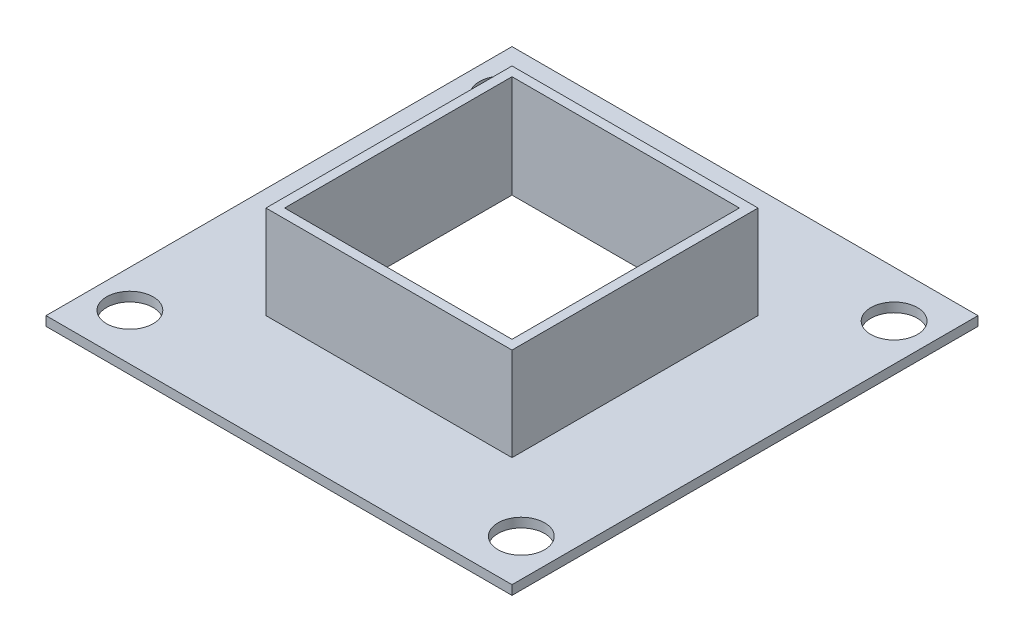
ISO-10303-21;
HEADER;
FILE_DESCRIPTION(('STEP AP214'),'2;1');
FILE_NAME('part.step','',(''),(''),'','','');
FILE_SCHEMA(('AUTOMOTIVE_DESIGN { 1 0 10303 214 1 1 1 1 }'));
ENDSEC;
DATA;
#1=APPLICATION_CONTEXT('core data for automotive mechanical design processes');
#2=APPLICATION_PROTOCOL_DEFINITION('international standard','automotive_design',2000,#1);
#3=PRODUCT_CONTEXT('',#1,'mechanical');
#4=PRODUCT('Part','Part','',(#3));
#5=PRODUCT_RELATED_PRODUCT_CATEGORY('part','',(#4));
#6=PRODUCT_DEFINITION_FORMATION('','',#4);
#7=PRODUCT_DEFINITION_CONTEXT('part definition',#1,'design');
#8=PRODUCT_DEFINITION('design','',#6,#7);
#9=PRODUCT_DEFINITION_SHAPE('','',#8);
#10=(LENGTH_UNIT() NAMED_UNIT(*) SI_UNIT(.MILLI.,.METRE.));
#11=(NAMED_UNIT(*) PLANE_ANGLE_UNIT() SI_UNIT($,.RADIAN.));
#12=(NAMED_UNIT(*) SI_UNIT($,.STERADIAN.) SOLID_ANGLE_UNIT());
#13=UNCERTAINTY_MEASURE_WITH_UNIT(LENGTH_MEASURE(1.E-05),#10,'distance_accuracy_value','');
#14=(GEOMETRIC_REPRESENTATION_CONTEXT(3) GLOBAL_UNCERTAINTY_ASSIGNED_CONTEXT((#13)) GLOBAL_UNIT_ASSIGNED_CONTEXT((#10,
#11,#12)) REPRESENTATION_CONTEXT('',''));
#15=CARTESIAN_POINT('',(0.,0.,0.));
#16=DIRECTION('',(0.,0.,1.));
#17=DIRECTION('',(1.,0.,0.));
#18=AXIS2_PLACEMENT_3D('',#15,#16,#17);
#19=CARTESIAN_POINT('',(0.,25.4,0.));
#20=DIRECTION('',(0.,-1.,0.));
#21=DIRECTION('',(0.,0.,-1.));
#22=AXIS2_PLACEMENT_3D('',#19,#20,#21);
#23=PLANE('',#22);
#24=DIRECTION('',(-1.,0.,0.));
#25=VECTOR('',#24,1.);
#26=CARTESIAN_POINT('',(-33.528,25.4,-33.528));
#27=LINE('',#26,#25);
#28=CARTESIAN_POINT('',(33.528,25.4,-33.528));
#29=VERTEX_POINT('',#28);
#30=CARTESIAN_POINT('',(-33.528,25.4,-33.528));
#31=VERTEX_POINT('',#30);
#32=EDGE_CURVE('E257',#29,#31,#27,.T.);
#33=ORIENTED_EDGE('',*,*,#32,.T.);
#34=DIRECTION('',(0.,0.,1.));
#35=VECTOR('',#34,1.);
#36=CARTESIAN_POINT('',(-33.528,25.4,-33.528));
#37=LINE('',#36,#35);
#38=CARTESIAN_POINT('',(-33.528,25.4,33.528));
#39=VERTEX_POINT('',#38);
#40=EDGE_CURVE('E261',#31,#39,#37,.T.);
#41=ORIENTED_EDGE('',*,*,#40,.T.);
#42=DIRECTION('',(1.,0.,0.));
#43=VECTOR('',#42,1.);
#44=CARTESIAN_POINT('',(-33.528,25.4,33.528));
#45=LINE('',#44,#43);
#46=CARTESIAN_POINT('',(33.528,25.4,33.528));
#47=VERTEX_POINT('',#46);
#48=EDGE_CURVE('E265',#39,#47,#45,.T.);
#49=ORIENTED_EDGE('',*,*,#48,.T.);
#50=DIRECTION('',(0.,0.,-1.));
#51=VECTOR('',#50,1.);
#52=CARTESIAN_POINT('',(33.528,25.4,-33.528));
#53=LINE('',#52,#51);
#54=EDGE_CURVE('E268',#47,#29,#53,.T.);
#55=ORIENTED_EDGE('',*,*,#54,.T.);
#56=EDGE_LOOP('',(#33,#41,#49,#55));
#57=FACE_BOUND('',#56,.T.);
#58=DIRECTION('',(0.,0.,-1.));
#59=VECTOR('',#58,1.);
#60=CARTESIAN_POINT('',(30.988,25.4,-30.988));
#61=LINE('',#60,#59);
#62=CARTESIAN_POINT('',(30.988,25.4,30.988));
#63=VERTEX_POINT('',#62);
#64=CARTESIAN_POINT('',(30.988,25.4,-30.988));
#65=VERTEX_POINT('',#64);
#66=EDGE_CURVE('E238',#63,#65,#61,.T.);
#67=ORIENTED_EDGE('',*,*,#66,.F.);
#68=DIRECTION('',(1.,0.,0.));
#69=VECTOR('',#68,1.);
#70=CARTESIAN_POINT('',(-30.988,25.4,30.988));
#71=LINE('',#70,#69);
#72=CARTESIAN_POINT('',(-30.988,25.4,30.988));
#73=VERTEX_POINT('',#72);
#74=EDGE_CURVE('E246',#73,#63,#71,.T.);
#75=ORIENTED_EDGE('',*,*,#74,.F.);
#76=DIRECTION('',(0.,0.,1.));
#77=VECTOR('',#76,1.);
#78=CARTESIAN_POINT('',(-30.988,25.4,-30.988));
#79=LINE('',#78,#77);
#80=CARTESIAN_POINT('',(-30.988,25.4,-30.988));
#81=VERTEX_POINT('',#80);
#82=EDGE_CURVE('E243',#81,#73,#79,.T.);
#83=ORIENTED_EDGE('',*,*,#82,.F.);
#84=DIRECTION('',(-1.,0.,0.));
#85=VECTOR('',#84,1.);
#86=CARTESIAN_POINT('',(-30.988,25.4,-30.988));
#87=LINE('',#86,#85);
#88=EDGE_CURVE('E140',#65,#81,#87,.T.);
#89=ORIENTED_EDGE('',*,*,#88,.F.);
#90=EDGE_LOOP('',(#67,#75,#83,#89));
#91=FACE_BOUND('',#90,.T.);
#92=ADVANCED_FACE('F45',(#57,#91),#23,.F.);
#93=CARTESIAN_POINT('',(-33.528,25.4,-33.528));
#94=DIRECTION('',(0.,0.,1.));
#95=DIRECTION('',(1.,0.,0.));
#96=AXIS2_PLACEMENT_3D('',#93,#94,#95);
#97=PLANE('',#96);
#98=DIRECTION('',(-1.,0.,0.));
#99=VECTOR('',#98,1.);
#100=CARTESIAN_POINT('',(-33.528,0.,-33.528));
#101=LINE('',#100,#99);
#102=CARTESIAN_POINT('',(33.528,0.,-33.528));
#103=VERTEX_POINT('',#102);
#104=CARTESIAN_POINT('',(-33.528,0.,-33.528));
#105=VERTEX_POINT('',#104);
#106=EDGE_CURVE('E256',#103,#105,#101,.T.);
#107=ORIENTED_EDGE('',*,*,#106,.T.);
#108=DIRECTION('',(0.,-1.,0.));
#109=VECTOR('',#108,1.);
#110=CARTESIAN_POINT('',(-33.528,25.4,-33.528));
#111=LINE('',#110,#109);
#112=EDGE_CURVE('E11',#31,#105,#111,.T.);
#113=ORIENTED_EDGE('',*,*,#112,.F.);
#114=ORIENTED_EDGE('',*,*,#32,.F.);
#115=DIRECTION('',(0.,-1.,0.));
#116=VECTOR('',#115,1.);
#117=CARTESIAN_POINT('',(33.528,25.4,-33.528));
#118=LINE('',#117,#116);
#119=EDGE_CURVE('E271',#29,#103,#118,.T.);
#120=ORIENTED_EDGE('',*,*,#119,.T.);
#121=EDGE_LOOP('',(#107,#113,#114,#120));
#122=FACE_BOUND('',#121,.T.);
#123=ADVANCED_FACE('F47',(#122),#97,.F.);
#124=CARTESIAN_POINT('',(-33.528,25.4,-33.528));
#125=DIRECTION('',(1.,0.,0.));
#126=DIRECTION('',(0.,0.,-1.));
#127=AXIS2_PLACEMENT_3D('',#124,#125,#126);
#128=PLANE('',#127);
#129=DIRECTION('',(0.,0.,1.));
#130=VECTOR('',#129,1.);
#131=CARTESIAN_POINT('',(-33.528,0.,-33.528));
#132=LINE('',#131,#130);
#133=CARTESIAN_POINT('',(-33.528,0.,33.528));
#134=VERTEX_POINT('',#133);
#135=EDGE_CURVE('E275',#105,#134,#132,.T.);
#136=ORIENTED_EDGE('',*,*,#135,.T.);
#137=DIRECTION('',(0.,-1.,0.));
#138=VECTOR('',#137,1.);
#139=CARTESIAN_POINT('',(-33.528,25.4,33.528));
#140=LINE('',#139,#138);
#141=EDGE_CURVE('E54',#39,#134,#140,.T.);
#142=ORIENTED_EDGE('',*,*,#141,.F.);
#143=ORIENTED_EDGE('',*,*,#40,.F.);
#144=ORIENTED_EDGE('',*,*,#112,.T.);
#145=EDGE_LOOP('',(#136,#142,#143,#144));
#146=FACE_BOUND('',#145,.T.);
#147=ADVANCED_FACE('F300',(#146),#128,.F.);
#148=CARTESIAN_POINT('',(-33.528,25.4,33.528));
#149=DIRECTION('',(0.,0.,-1.));
#150=DIRECTION('',(-1.,0.,0.));
#151=AXIS2_PLACEMENT_3D('',#148,#149,#150);
#152=PLANE('',#151);
#153=DIRECTION('',(1.,0.,0.));
#154=VECTOR('',#153,1.);
#155=CARTESIAN_POINT('',(-33.528,0.,33.528));
#156=LINE('',#155,#154);
#157=CARTESIAN_POINT('',(33.528,0.,33.528));
#158=VERTEX_POINT('',#157);
#159=EDGE_CURVE('E279',#134,#158,#156,.T.);
#160=ORIENTED_EDGE('',*,*,#159,.T.);
#161=DIRECTION('',(0.,-1.,0.));
#162=VECTOR('',#161,1.);
#163=CARTESIAN_POINT('',(33.528,25.4,33.528));
#164=LINE('',#163,#162);
#165=EDGE_CURVE('E289',#47,#158,#164,.T.);
#166=ORIENTED_EDGE('',*,*,#165,.F.);
#167=ORIENTED_EDGE('',*,*,#48,.F.);
#168=ORIENTED_EDGE('',*,*,#141,.T.);
#169=EDGE_LOOP('',(#160,#166,#167,#168));
#170=FACE_BOUND('',#169,.T.);
#171=ADVANCED_FACE('F297',(#170),#152,.F.);
#172=CARTESIAN_POINT('',(33.528,25.4,-33.528));
#173=DIRECTION('',(-1.,0.,0.));
#174=DIRECTION('',(0.,0.,1.));
#175=AXIS2_PLACEMENT_3D('',#172,#173,#174);
#176=PLANE('',#175);
#177=DIRECTION('',(0.,0.,-1.));
#178=VECTOR('',#177,1.);
#179=CARTESIAN_POINT('',(33.528,0.,-33.528));
#180=LINE('',#179,#178);
#181=EDGE_CURVE('E262',#158,#103,#180,.T.);
#182=ORIENTED_EDGE('',*,*,#181,.T.);
#183=ORIENTED_EDGE('',*,*,#119,.F.);
#184=ORIENTED_EDGE('',*,*,#54,.F.);
#185=ORIENTED_EDGE('',*,*,#165,.T.);
#186=EDGE_LOOP('',(#182,#183,#184,#185));
#187=FACE_BOUND('',#186,.T.);
#188=ADVANCED_FACE('F306',(#187),#176,.F.);
#189=CARTESIAN_POINT('',(30.988,25.4,-30.988));
#190=DIRECTION('',(-1.,0.,0.));
#191=DIRECTION('',(0.,0.,1.));
#192=AXIS2_PLACEMENT_3D('',#189,#190,#191);
#193=PLANE('',#192);
#194=DIRECTION('',(0.,-1.,0.));
#195=VECTOR('',#194,1.);
#196=CARTESIAN_POINT('',(30.988,25.4,-30.988));
#197=LINE('',#196,#195);
#198=CARTESIAN_POINT('',(30.988,-2.54,-30.988));
#199=VERTEX_POINT('',#198);
#200=EDGE_CURVE('E143',#65,#199,#197,.T.);
#201=ORIENTED_EDGE('',*,*,#200,.T.);
#202=DIRECTION('',(0.,0.,-1.));
#203=VECTOR('',#202,1.);
#204=CARTESIAN_POINT('',(30.988,-2.54,30.988));
#205=LINE('',#204,#203);
#206=CARTESIAN_POINT('',(30.988,-2.54,30.988));
#207=VERTEX_POINT('',#206);
#208=EDGE_CURVE('E156',#207,#199,#205,.T.);
#209=ORIENTED_EDGE('',*,*,#208,.F.);
#210=DIRECTION('',(0.,-1.,0.));
#211=VECTOR('',#210,1.);
#212=CARTESIAN_POINT('',(30.988,25.4,30.988));
#213=LINE('',#212,#211);
#214=EDGE_CURVE('E249',#63,#207,#213,.T.);
#215=ORIENTED_EDGE('',*,*,#214,.F.);
#216=ORIENTED_EDGE('',*,*,#66,.T.);
#217=EDGE_LOOP('',(#201,#209,#215,#216));
#218=FACE_BOUND('',#217,.T.);
#219=ADVANCED_FACE('F318',(#218),#193,.T.);
#220=CARTESIAN_POINT('',(-30.988,25.4,-30.988));
#221=DIRECTION('',(0.,0.,1.));
#222=DIRECTION('',(1.,0.,0.));
#223=AXIS2_PLACEMENT_3D('',#220,#221,#222);
#224=PLANE('',#223);
#225=DIRECTION('',(0.,-1.,0.));
#226=VECTOR('',#225,1.);
#227=CARTESIAN_POINT('',(-30.988,25.4,-30.988));
#228=LINE('',#227,#226);
#229=CARTESIAN_POINT('',(-30.988,-2.54,-30.988));
#230=VERTEX_POINT('',#229);
#231=EDGE_CURVE('E133',#81,#230,#228,.T.);
#232=ORIENTED_EDGE('',*,*,#231,.T.);
#233=DIRECTION('',(-1.,0.,0.));
#234=VECTOR('',#233,1.);
#235=CARTESIAN_POINT('',(30.988,-2.54,-30.988));
#236=LINE('',#235,#234);
#237=EDGE_CURVE('E137',#199,#230,#236,.T.);
#238=ORIENTED_EDGE('',*,*,#237,.F.);
#239=ORIENTED_EDGE('',*,*,#200,.F.);
#240=ORIENTED_EDGE('',*,*,#88,.T.);
#241=EDGE_LOOP('',(#232,#238,#239,#240));
#242=FACE_BOUND('',#241,.T.);
#243=ADVANCED_FACE('F134',(#242),#224,.T.);
#244=CARTESIAN_POINT('',(-30.988,25.4,-30.988));
#245=DIRECTION('',(1.,0.,0.));
#246=DIRECTION('',(0.,0.,-1.));
#247=AXIS2_PLACEMENT_3D('',#244,#245,#246);
#248=PLANE('',#247);
#249=DIRECTION('',(0.,-1.,0.));
#250=VECTOR('',#249,1.);
#251=CARTESIAN_POINT('',(-30.988,25.4,30.988));
#252=LINE('',#251,#250);
#253=CARTESIAN_POINT('',(-30.988,-2.54,30.988));
#254=VERTEX_POINT('',#253);
#255=EDGE_CURVE('E61',#73,#254,#252,.T.);
#256=ORIENTED_EDGE('',*,*,#255,.T.);
#257=DIRECTION('',(0.,0.,1.));
#258=VECTOR('',#257,1.);
#259=CARTESIAN_POINT('',(-30.988,-2.54,-30.988));
#260=LINE('',#259,#258);
#261=EDGE_CURVE('E146',#230,#254,#260,.T.);
#262=ORIENTED_EDGE('',*,*,#261,.F.);
#263=ORIENTED_EDGE('',*,*,#231,.F.);
#264=ORIENTED_EDGE('',*,*,#82,.T.);
#265=EDGE_LOOP('',(#256,#262,#263,#264));
#266=FACE_BOUND('',#265,.T.);
#267=ADVANCED_FACE('F147',(#266),#248,.T.);
#268=CARTESIAN_POINT('',(-30.988,25.4,30.988));
#269=DIRECTION('',(0.,0.,-1.));
#270=DIRECTION('',(-1.,0.,0.));
#271=AXIS2_PLACEMENT_3D('',#268,#269,#270);
#272=PLANE('',#271);
#273=ORIENTED_EDGE('',*,*,#214,.T.);
#274=DIRECTION('',(1.,0.,0.));
#275=VECTOR('',#274,1.);
#276=CARTESIAN_POINT('',(-30.988,-2.54,30.988));
#277=LINE('',#276,#275);
#278=EDGE_CURVE('E151',#254,#207,#277,.T.);
#279=ORIENTED_EDGE('',*,*,#278,.F.);
#280=ORIENTED_EDGE('',*,*,#255,.F.);
#281=ORIENTED_EDGE('',*,*,#74,.T.);
#282=EDGE_LOOP('',(#273,#279,#280,#281));
#283=FACE_BOUND('',#282,.T.);
#284=ADVANCED_FACE('F319',(#283),#272,.T.);
#285=CARTESIAN_POINT('',(0.,0.,0.));
#286=DIRECTION('',(0.,1.,0.));
#287=DIRECTION('',(0.,0.,1.));
#288=AXIS2_PLACEMENT_3D('',#285,#286,#287);
#289=PLANE('',#288);
#290=CARTESIAN_POINT('',(-53.34,0.,50.8));
#291=DIRECTION('',(0.,1.,0.));
#292=DIRECTION('',(0.,0.,1.));
#293=AXIS2_PLACEMENT_3D('',#290,#291,#292);
#294=CIRCLE('',#293,6.34999999999994);
#295=CARTESIAN_POINT('',(-53.34,0.,57.1499999999999));
#296=VERTEX_POINT('',#295);
#297=EDGE_CURVE('E182',#296,#296,#294,.T.);
#298=ORIENTED_EDGE('',*,*,#297,.F.);
#299=EDGE_LOOP('',(#298));
#300=FACE_BOUND('',#299,.T.);
#301=CARTESIAN_POINT('',(53.34,0.,50.8));
#302=DIRECTION('',(0.,1.,0.));
#303=DIRECTION('',(0.,0.,1.));
#304=AXIS2_PLACEMENT_3D('',#301,#302,#303);
#305=CIRCLE('',#304,6.34999999999994);
#306=CARTESIAN_POINT('',(53.34,0.,57.1499999999999));
#307=VERTEX_POINT('',#306);
#308=EDGE_CURVE('E174',#307,#307,#305,.T.);
#309=ORIENTED_EDGE('',*,*,#308,.F.);
#310=EDGE_LOOP('',(#309));
#311=FACE_BOUND('',#310,.T.);
#312=CARTESIAN_POINT('',(53.34,0.,-50.8));
#313=DIRECTION('',(0.,1.,0.));
#314=DIRECTION('',(0.,0.,1.));
#315=AXIS2_PLACEMENT_3D('',#312,#313,#314);
#316=CIRCLE('',#315,6.34999999999994);
#317=CARTESIAN_POINT('',(53.34,0.,-44.4500000000001));
#318=VERTEX_POINT('',#317);
#319=EDGE_CURVE('E165',#318,#318,#316,.T.);
#320=ORIENTED_EDGE('',*,*,#319,.F.);
#321=EDGE_LOOP('',(#320));
#322=FACE_BOUND('',#321,.T.);
#323=CARTESIAN_POINT('',(-53.34,0.,-50.8));
#324=DIRECTION('',(0.,1.,0.));
#325=DIRECTION('',(0.,0.,1.));
#326=AXIS2_PLACEMENT_3D('',#323,#324,#325);
#327=CIRCLE('',#326,6.34999999999994);
#328=CARTESIAN_POINT('',(-53.34,0.,-44.4500000000001));
#329=VERTEX_POINT('',#328);
#330=EDGE_CURVE('E169',#329,#329,#327,.T.);
#331=ORIENTED_EDGE('',*,*,#330,.F.);
#332=EDGE_LOOP('',(#331));
#333=FACE_BOUND('',#332,.T.);
#334=DIRECTION('',(0.,0.,1.));
#335=VECTOR('',#334,1.);
#336=CARTESIAN_POINT('',(63.5,0.,-63.5));
#337=LINE('',#336,#335);
#338=CARTESIAN_POINT('',(63.5,0.,-63.5));
#339=VERTEX_POINT('',#338);
#340=CARTESIAN_POINT('',(63.5,0.,63.5));
#341=VERTEX_POINT('',#340);
#342=EDGE_CURVE('E193',#339,#341,#337,.T.);
#343=ORIENTED_EDGE('',*,*,#342,.F.);
#344=DIRECTION('',(1.,0.,0.));
#345=VECTOR('',#344,1.);
#346=CARTESIAN_POINT('',(-63.5,0.,-63.5));
#347=LINE('',#346,#345);
#348=CARTESIAN_POINT('',(-63.5,0.,-63.5));
#349=VERTEX_POINT('',#348);
#350=EDGE_CURVE('E202',#349,#339,#347,.T.);
#351=ORIENTED_EDGE('',*,*,#350,.F.);
#352=DIRECTION('',(0.,0.,-1.));
#353=VECTOR('',#352,1.);
#354=CARTESIAN_POINT('',(-63.5,0.,-63.5));
#355=LINE('',#354,#353);
#356=CARTESIAN_POINT('',(-63.5,0.,63.5));
#357=VERTEX_POINT('',#356);
#358=EDGE_CURVE('E218',#357,#349,#355,.T.);
#359=ORIENTED_EDGE('',*,*,#358,.F.);
#360=DIRECTION('',(-1.,0.,0.));
#361=VECTOR('',#360,1.);
#362=CARTESIAN_POINT('',(-63.5,0.,63.5));
#363=LINE('',#362,#361);
#364=EDGE_CURVE('E215',#341,#357,#363,.T.);
#365=ORIENTED_EDGE('',*,*,#364,.F.);
#366=EDGE_LOOP('',(#343,#351,#359,#365));
#367=FACE_BOUND('',#366,.T.);
#368=ORIENTED_EDGE('',*,*,#106,.F.);
#369=ORIENTED_EDGE('',*,*,#181,.F.);
#370=ORIENTED_EDGE('',*,*,#159,.F.);
#371=ORIENTED_EDGE('',*,*,#135,.F.);
#372=EDGE_LOOP('',(#368,#369,#370,#371));
#373=FACE_BOUND('',#372,.T.);
#374=ADVANCED_FACE('F303',(#300,#311,#322,#333,#367,#373),#289,.T.);
#375=CARTESIAN_POINT('',(63.5,-2.54,-63.5));
#376=DIRECTION('',(-1.,0.,0.));
#377=DIRECTION('',(0.,0.,1.));
#378=AXIS2_PLACEMENT_3D('',#375,#376,#377);
#379=PLANE('',#378);
#380=ORIENTED_EDGE('',*,*,#342,.T.);
#381=DIRECTION('',(0.,1.,0.));
#382=VECTOR('',#381,1.);
#383=CARTESIAN_POINT('',(63.5,-2.54,63.5));
#384=LINE('',#383,#382);
#385=CARTESIAN_POINT('',(63.5,-2.54,63.5));
#386=VERTEX_POINT('',#385);
#387=EDGE_CURVE('E234',#386,#341,#384,.T.);
#388=ORIENTED_EDGE('',*,*,#387,.F.);
#389=DIRECTION('',(0.,0.,1.));
#390=VECTOR('',#389,1.);
#391=CARTESIAN_POINT('',(63.5,-2.54,-63.5));
#392=LINE('',#391,#390);
#393=CARTESIAN_POINT('',(63.5,-2.54,-63.5));
#394=VERTEX_POINT('',#393);
#395=EDGE_CURVE('E197',#394,#386,#392,.T.);
#396=ORIENTED_EDGE('',*,*,#395,.F.);
#397=DIRECTION('',(0.,1.,0.));
#398=VECTOR('',#397,1.);
#399=CARTESIAN_POINT('',(63.5,-2.54,-63.5));
#400=LINE('',#399,#398);
#401=EDGE_CURVE('E211',#394,#339,#400,.T.);
#402=ORIENTED_EDGE('',*,*,#401,.T.);
#403=EDGE_LOOP('',(#380,#388,#396,#402));
#404=FACE_BOUND('',#403,.T.);
#405=ADVANCED_FACE('F327',(#404),#379,.F.);
#406=CARTESIAN_POINT('',(-63.5,-2.54,63.5));
#407=DIRECTION('',(0.,0.,-1.));
#408=DIRECTION('',(-1.,0.,0.));
#409=AXIS2_PLACEMENT_3D('',#406,#407,#408);
#410=PLANE('',#409);
#411=ORIENTED_EDGE('',*,*,#364,.T.);
#412=DIRECTION('',(0.,1.,0.));
#413=VECTOR('',#412,1.);
#414=CARTESIAN_POINT('',(-63.5,-2.54,63.5));
#415=LINE('',#414,#413);
#416=CARTESIAN_POINT('',(-63.5,-2.54,63.5));
#417=VERTEX_POINT('',#416);
#418=EDGE_CURVE('E230',#417,#357,#415,.T.);
#419=ORIENTED_EDGE('',*,*,#418,.F.);
#420=DIRECTION('',(-1.,0.,0.));
#421=VECTOR('',#420,1.);
#422=CARTESIAN_POINT('',(-63.5,-2.54,63.5));
#423=LINE('',#422,#421);
#424=EDGE_CURVE('E201',#386,#417,#423,.T.);
#425=ORIENTED_EDGE('',*,*,#424,.F.);
#426=ORIENTED_EDGE('',*,*,#387,.T.);
#427=EDGE_LOOP('',(#411,#419,#425,#426));
#428=FACE_BOUND('',#427,.T.);
#429=ADVANCED_FACE('F404',(#428),#410,.F.);
#430=CARTESIAN_POINT('',(-63.5,-2.54,-63.5));
#431=DIRECTION('',(1.,0.,0.));
#432=DIRECTION('',(0.,0.,-1.));
#433=AXIS2_PLACEMENT_3D('',#430,#431,#432);
#434=PLANE('',#433);
#435=ORIENTED_EDGE('',*,*,#358,.T.);
#436=DIRECTION('',(0.,1.,0.));
#437=VECTOR('',#436,1.);
#438=CARTESIAN_POINT('',(-63.5,-2.54,-63.5));
#439=LINE('',#438,#437);
#440=CARTESIAN_POINT('',(-63.5,-2.54,-63.5));
#441=VERTEX_POINT('',#440);
#442=EDGE_CURVE('E226',#441,#349,#439,.T.);
#443=ORIENTED_EDGE('',*,*,#442,.F.);
#444=DIRECTION('',(0.,0.,-1.));
#445=VECTOR('',#444,1.);
#446=CARTESIAN_POINT('',(-63.5,-2.54,-63.5));
#447=LINE('',#446,#445);
#448=EDGE_CURVE('E205',#417,#441,#447,.T.);
#449=ORIENTED_EDGE('',*,*,#448,.F.);
#450=ORIENTED_EDGE('',*,*,#418,.T.);
#451=EDGE_LOOP('',(#435,#443,#449,#450));
#452=FACE_BOUND('',#451,.T.);
#453=ADVANCED_FACE('F412',(#452),#434,.F.);
#454=CARTESIAN_POINT('',(-63.5,-2.54,-63.5));
#455=DIRECTION('',(0.,0.,1.));
#456=DIRECTION('',(1.,0.,0.));
#457=AXIS2_PLACEMENT_3D('',#454,#455,#456);
#458=PLANE('',#457);
#459=ORIENTED_EDGE('',*,*,#350,.T.);
#460=ORIENTED_EDGE('',*,*,#401,.F.);
#461=DIRECTION('',(1.,0.,0.));
#462=VECTOR('',#461,1.);
#463=CARTESIAN_POINT('',(-63.5,-2.54,-63.5));
#464=LINE('',#463,#462);
#465=EDGE_CURVE('E208',#441,#394,#464,.T.);
#466=ORIENTED_EDGE('',*,*,#465,.F.);
#467=ORIENTED_EDGE('',*,*,#442,.T.);
#468=EDGE_LOOP('',(#459,#460,#466,#467));
#469=FACE_BOUND('',#468,.T.);
#470=ADVANCED_FACE('F420',(#469),#458,.F.);
#471=CARTESIAN_POINT('',(0.,-2.54,0.));
#472=DIRECTION('',(0.,1.,0.));
#473=DIRECTION('',(0.,0.,1.));
#474=AXIS2_PLACEMENT_3D('',#471,#472,#473);
#475=PLANE('',#474);
#476=ORIENTED_EDGE('',*,*,#208,.T.);
#477=ORIENTED_EDGE('',*,*,#237,.T.);
#478=ORIENTED_EDGE('',*,*,#261,.T.);
#479=ORIENTED_EDGE('',*,*,#278,.T.);
#480=EDGE_LOOP('',(#476,#477,#478,#479));
#481=FACE_BOUND('',#480,.T.);
#482=CARTESIAN_POINT('',(-53.34,-2.54,50.8));
#483=DIRECTION('',(0.,1.,0.));
#484=DIRECTION('',(0.,0.,1.));
#485=AXIS2_PLACEMENT_3D('',#482,#483,#484);
#486=CIRCLE('',#485,6.34999999999994);
#487=CARTESIAN_POINT('',(-53.34,-2.54,57.1499999999999));
#488=VERTEX_POINT('',#487);
#489=EDGE_CURVE('E164',#488,#488,#486,.T.);
#490=ORIENTED_EDGE('',*,*,#489,.T.);
#491=EDGE_LOOP('',(#490));
#492=FACE_BOUND('',#491,.T.);
#493=CARTESIAN_POINT('',(53.34,-2.54,50.8));
#494=DIRECTION('',(0.,1.,0.));
#495=DIRECTION('',(0.,0.,1.));
#496=AXIS2_PLACEMENT_3D('',#493,#494,#495);
#497=CIRCLE('',#496,6.34999999999994);
#498=CARTESIAN_POINT('',(53.34,-2.54,57.1499999999999));
#499=VERTEX_POINT('',#498);
#500=EDGE_CURVE('E178',#499,#499,#497,.T.);
#501=ORIENTED_EDGE('',*,*,#500,.T.);
#502=EDGE_LOOP('',(#501));
#503=FACE_BOUND('',#502,.T.);
#504=CARTESIAN_POINT('',(53.34,-2.54,-50.8));
#505=DIRECTION('',(0.,1.,0.));
#506=DIRECTION('',(0.,0.,1.));
#507=AXIS2_PLACEMENT_3D('',#504,#505,#506);
#508=CIRCLE('',#507,6.34999999999994);
#509=CARTESIAN_POINT('',(53.34,-2.54,-44.4500000000001));
#510=VERTEX_POINT('',#509);
#511=EDGE_CURVE('E170',#510,#510,#508,.T.);
#512=ORIENTED_EDGE('',*,*,#511,.T.);
#513=EDGE_LOOP('',(#512));
#514=FACE_BOUND('',#513,.T.);
#515=CARTESIAN_POINT('',(-53.34,-2.54,-50.8));
#516=DIRECTION('',(0.,1.,0.));
#517=DIRECTION('',(0.,0.,1.));
#518=AXIS2_PLACEMENT_3D('',#515,#516,#517);
#519=CIRCLE('',#518,6.34999999999994);
#520=CARTESIAN_POINT('',(-53.34,-2.54,-44.4500000000001));
#521=VERTEX_POINT('',#520);
#522=EDGE_CURVE('E189',#521,#521,#519,.T.);
#523=ORIENTED_EDGE('',*,*,#522,.T.);
#524=EDGE_LOOP('',(#523));
#525=FACE_BOUND('',#524,.T.);
#526=ORIENTED_EDGE('',*,*,#395,.T.);
#527=ORIENTED_EDGE('',*,*,#424,.T.);
#528=ORIENTED_EDGE('',*,*,#448,.T.);
#529=ORIENTED_EDGE('',*,*,#465,.T.);
#530=EDGE_LOOP('',(#526,#527,#528,#529));
#531=FACE_BOUND('',#530,.T.);
#532=ADVANCED_FACE('F153',(#481,#492,#503,#514,#525,#531),#475,.F.);
#533=CARTESIAN_POINT('',(-53.34,-2.54,-50.8));
#534=DIRECTION('',(0.,1.,0.));
#535=DIRECTION('',(0.,0.,1.));
#536=AXIS2_PLACEMENT_3D('',#533,#534,#535);
#537=CYLINDRICAL_SURFACE('',#536,6.34999999999994);
#538=ORIENTED_EDGE('',*,*,#522,.F.);
#539=EDGE_LOOP('',(#538));
#540=FACE_BOUND('',#539,.T.);
#541=ORIENTED_EDGE('',*,*,#330,.T.);
#542=EDGE_LOOP('',(#541));
#543=FACE_BOUND('',#542,.T.);
#544=ADVANCED_FACE('F436',(#540,#543),#537,.F.);
#545=CARTESIAN_POINT('',(53.34,-2.54,-50.8));
#546=DIRECTION('',(0.,1.,0.));
#547=DIRECTION('',(0.,0.,1.));
#548=AXIS2_PLACEMENT_3D('',#545,#546,#547);
#549=CYLINDRICAL_SURFACE('',#548,6.34999999999994);
#550=ORIENTED_EDGE('',*,*,#511,.F.);
#551=EDGE_LOOP('',(#550));
#552=FACE_BOUND('',#551,.T.);
#553=ORIENTED_EDGE('',*,*,#319,.T.);
#554=EDGE_LOOP('',(#553));
#555=FACE_BOUND('',#554,.T.);
#556=ADVANCED_FACE('F444',(#552,#555),#549,.F.);
#557=CARTESIAN_POINT('',(53.34,-2.54,50.8));
#558=DIRECTION('',(0.,1.,0.));
#559=DIRECTION('',(0.,0.,1.));
#560=AXIS2_PLACEMENT_3D('',#557,#558,#559);
#561=CYLINDRICAL_SURFACE('',#560,6.34999999999994);
#562=ORIENTED_EDGE('',*,*,#500,.F.);
#563=EDGE_LOOP('',(#562));
#564=FACE_BOUND('',#563,.T.);
#565=ORIENTED_EDGE('',*,*,#308,.T.);
#566=EDGE_LOOP('',(#565));
#567=FACE_BOUND('',#566,.T.);
#568=ADVANCED_FACE('F453',(#564,#567),#561,.F.);
#569=CARTESIAN_POINT('',(-53.34,-2.54,50.8));
#570=DIRECTION('',(0.,1.,0.));
#571=DIRECTION('',(0.,0.,1.));
#572=AXIS2_PLACEMENT_3D('',#569,#570,#571);
#573=CYLINDRICAL_SURFACE('',#572,6.34999999999994);
#574=ORIENTED_EDGE('',*,*,#489,.F.);
#575=EDGE_LOOP('',(#574));
#576=FACE_BOUND('',#575,.T.);
#577=ORIENTED_EDGE('',*,*,#297,.T.);
#578=EDGE_LOOP('',(#577));
#579=FACE_BOUND('',#578,.T.);
#580=ADVANCED_FACE('F462',(#576,#579),#573,.F.);
#581=CLOSED_SHELL('',(#92,#123,#147,#171,#188,#219,#243,#267,#284,#374,#405,#429,#453,#470,#532,
#544,#556,#568,#580));
#582=MANIFOLD_SOLID_BREP('B2',#581);
#583=ADVANCED_BREP_SHAPE_REPRESENTATION('',(#18,#582),#14);
#584=SHAPE_DEFINITION_REPRESENTATION(#9,#583);
ENDSEC;
END-ISO-10303-21;
